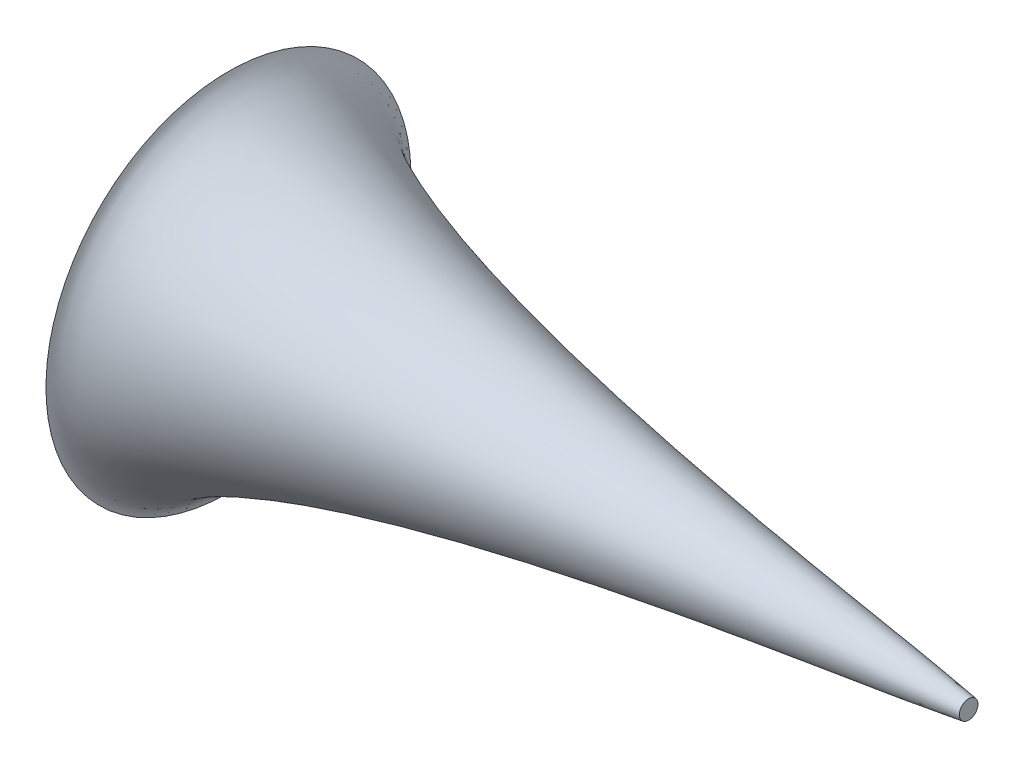
ISO-10303-21;
HEADER;
FILE_DESCRIPTION(('STEP AP214'),'2;1');
FILE_NAME('part.step','',(''),(''),'','','');
FILE_SCHEMA(('AUTOMOTIVE_DESIGN { 1 0 10303 214 1 1 1 1 }'));
ENDSEC;
DATA;
#1=APPLICATION_CONTEXT('core data for automotive mechanical design processes');
#2=APPLICATION_PROTOCOL_DEFINITION('international standard','automotive_design',2000,#1);
#3=PRODUCT_CONTEXT('',#1,'mechanical');
#4=PRODUCT('Part','Part','',(#3));
#5=PRODUCT_RELATED_PRODUCT_CATEGORY('part','',(#4));
#6=PRODUCT_DEFINITION_FORMATION('','',#4);
#7=PRODUCT_DEFINITION_CONTEXT('part definition',#1,'design');
#8=PRODUCT_DEFINITION('design','',#6,#7);
#9=PRODUCT_DEFINITION_SHAPE('','',#8);
#10=(LENGTH_UNIT() NAMED_UNIT(*) SI_UNIT(.MILLI.,.METRE.));
#11=(NAMED_UNIT(*) PLANE_ANGLE_UNIT() SI_UNIT($,.RADIAN.));
#12=(NAMED_UNIT(*) SI_UNIT($,.STERADIAN.) SOLID_ANGLE_UNIT());
#13=UNCERTAINTY_MEASURE_WITH_UNIT(LENGTH_MEASURE(1.E-05),#10,'distance_accuracy_value','');
#14=(GEOMETRIC_REPRESENTATION_CONTEXT(3) GLOBAL_UNCERTAINTY_ASSIGNED_CONTEXT((#13)) GLOBAL_UNIT_ASSIGNED_CONTEXT((#10,
#11,#12)) REPRESENTATION_CONTEXT('',''));
#15=CARTESIAN_POINT('',(0.,0.,0.));
#16=DIRECTION('',(0.,0.,1.));
#17=DIRECTION('',(1.,0.,0.));
#18=AXIS2_PLACEMENT_3D('',#15,#16,#17);
#19=CARTESIAN_POINT('',(102.602827350741,1.29640535163829,0.));
#20=CARTESIAN_POINT('',(101.30783530733,1.4860392481115,0.));
#21=CARTESIAN_POINT('',(99.0890550643406,1.81094930839849,0.));
#22=CARTESIAN_POINT('',(95.982778147195,2.24838979218013,0.));
#23=CARTESIAN_POINT('',(93.2934154301074,2.60691223367868,0.));
#24=CARTESIAN_POINT('',(90.6610180598882,2.94649116716827,0.));
#25=CARTESIAN_POINT('',(88.0028759358108,3.27762262314463,0.));
#26=CARTESIAN_POINT('',(85.3353915975262,3.61914481132584,0.));
#27=CARTESIAN_POINT('',(82.697877775363,3.9642635078406,0.));
#28=CARTESIAN_POINT('',(80.1628026617709,4.29745747858391,0.));
#29=CARTESIAN_POINT('',(77.7185372264278,4.62024778991419,0.));
#30=CARTESIAN_POINT('',(75.2874120028403,4.94180984509993,0.));
#31=CARTESIAN_POINT('',(72.8844146689748,5.27159887786089,0.));
#32=CARTESIAN_POINT('',(70.5261567062274,5.59970688141345,0.));
#33=CARTESIAN_POINT('',(68.2556983787091,5.92022156106632,0.));
#34=CARTESIAN_POINT('',(66.0138055766903,6.24000540538133,0.));
#35=CARTESIAN_POINT('',(63.8058521271992,6.56514107213416,0.));
#36=CARTESIAN_POINT('',(61.6414371018312,6.88975949444084,0.));
#37=CARTESIAN_POINT('',(59.5399173239007,7.21001620939399,0.));
#38=CARTESIAN_POINT('',(57.4741981186759,7.53169535507364,0.));
#39=CARTESIAN_POINT('',(55.4456721371335,7.855773281869,0.));
#40=CARTESIAN_POINT('',(53.4725369298471,8.17758973965462,0.));
#41=CARTESIAN_POINT('',(51.5378860240744,8.49813854708863,0.));
#42=CARTESIAN_POINT('',(49.6421928987376,8.82173889884151,0.));
#43=CARTESIAN_POINT('',(47.7855770043129,9.14566570955426,0.));
#44=CARTESIAN_POINT('',(45.976749193766,9.46728214953978,0.));
#45=CARTESIAN_POINT('',(44.2080943795777,9.79032659477329,0.));
#46=CARTESIAN_POINT('',(42.4789803973668,10.1137981501915,0.));
#47=CARTESIAN_POINT('',(40.7924880295433,10.4357820518005,0.));
#48=CARTESIAN_POINT('',(39.1470139808039,10.7583629066834,0.));
#49=CARTESIAN_POINT('',(37.5416909121418,11.0809361727218,0.));
#50=CARTESIAN_POINT('',(35.975380158997,11.4023813085769,0.));
#51=CARTESIAN_POINT('',(34.4505135868508,11.7240318907528,0.));
#52=CARTESIAN_POINT('',(32.9641682479258,12.0453135429327,0.));
#53=CARTESIAN_POINT('',(31.5164287028101,12.3653418749793,0.));
#54=CARTESIAN_POINT('',(30.1101818682611,12.6850928136249,0.));
#55=CARTESIAN_POINT('',(28.737407170817,13.0046837443431,0.));
#56=CARTESIAN_POINT('',(27.4067720570208,13.3225084421185,0.));
#57=CARTESIAN_POINT('',(26.1173258019394,13.6388997002961,0.));
#58=CARTESIAN_POINT('',(24.8602886497066,13.9546344019831,0.));
#59=CARTESIAN_POINT('',(23.645020088169,14.2687505552191,0.));
#60=CARTESIAN_POINT('',(22.4614876863863,14.5823857170225,0.));
#61=CARTESIAN_POINT('',(21.3186458463609,14.8935203517181,0.));
#62=CARTESIAN_POINT('',(20.2138203352792,15.2025977665398,0.));
#63=CARTESIAN_POINT('',(19.1418978833922,15.5102840518628,0.));
#64=CARTESIAN_POINT('',(18.111343585981,15.814780957447,0.));
#65=CARTESIAN_POINT('',(17.1090349624144,16.1185912467767,0.));
#66=CARTESIAN_POINT('',(16.1480947593759,16.4186360289038,0.));
#67=CARTESIAN_POINT('',(15.2152869431263,16.717725087723,0.));
#68=CARTESIAN_POINT('',(14.3225359015949,17.012557012406,0.));
#69=CARTESIAN_POINT('',(13.4596078512331,17.3055281715088,0.));
#70=CARTESIAN_POINT('',(12.6336676776253,17.5943932948036,0.));
#71=CARTESIAN_POINT('',(11.8380002912862,17.8807345856671,0.));
#72=CARTESIAN_POINT('',(11.0774376925416,18.1628197902775,0.));
#73=CARTESIAN_POINT('',(10.3464866754969,18.4419927102913,0.));
#74=CARTESIAN_POINT('',(9.64984849906658,18.716395941831,0.));
#75=CARTESIAN_POINT('',(8.98113949963053,18.9878277300666,0.));
#76=CARTESIAN_POINT('',(8.34693062033733,19.2535503514199,0.));
#77=CARTESIAN_POINT('',(7.73802410938301,19.5166386093796,0.));
#78=CARTESIAN_POINT('',(7.16326902960444,19.7732127412955,0.));
#79=CARTESIAN_POINT('',(6.61176616263548,20.0273506756737,0.));
#80=CARTESIAN_POINT('',(6.09245619358488,20.274788093451,0.));
#81=CARTESIAN_POINT('',(5.59739491321512,20.5186114176915,0.));
#82=CARTESIAN_POINT('',(5.131115322291,20.7562289167767,0.));
#83=CARTESIAN_POINT('',(4.69249252100954,20.9876069507676,0.));
#84=CARTESIAN_POINT('',(4.27680094845867,21.2147210597118,0.));
#85=CARTESIAN_POINT('',(3.88775107856244,21.4350832657669,0.));
#86=CARTESIAN_POINT('',(3.52019681282255,21.6509716537916,0.));
#87=CARTESIAN_POINT('',(3.1774689226165,21.8599812775175,0.));
#88=CARTESIAN_POINT('',(2.85798044640234,22.0623509412686,0.));
#89=CARTESIAN_POINT('',(2.55909006407686,22.2592326116133,0.));
#90=CARTESIAN_POINT('',(2.28168626847477,22.4494307748566,0.));
#91=CARTESIAN_POINT('',(2.02436283230884,22.6331678776642,0.));
#92=CARTESIAN_POINT('',(1.78659949341602,22.8103019934508,0.));
#93=CARTESIAN_POINT('',(1.56719940485286,22.9809882973866,0.));
#94=CARTESIAN_POINT('',(1.36493335038758,23.1454412271058,0.));
#95=CARTESIAN_POINT('',(1.1810633375169,23.3019954016058,0.));
#96=CARTESIAN_POINT('',(1.01260739148691,23.4524802493133,0.));
#97=CARTESIAN_POINT('',(0.858468391473778,23.5970417630544,0.));
#98=CARTESIAN_POINT('',(0.719443465609688,23.7341965380326,0.));
#99=CARTESIAN_POINT('',(0.595125281530059,23.8636465962845,0.));
#100=CARTESIAN_POINT('',(0.482442645174261,23.9876783764902,0.));
#101=CARTESIAN_POINT('',(0.380535302779585,24.1064391414272,0.));
#102=CARTESIAN_POINT('',(0.290939558067533,24.2173825482975,0.));
#103=CARTESIAN_POINT('',(0.213334194764,24.3198652148961,0.));
#104=CARTESIAN_POINT('',(0.144079958190839,24.417864636037,0.));
#105=CARTESIAN_POINT('',(0.0821429505746585,24.511964999009,0.));
#106=CARTESIAN_POINT('',(0.0279908653003298,24.600574940189,0.));
#107=CARTESIAN_POINT('',(-0.0171704725853648,24.6808944151075,0.));
#108=CARTESIAN_POINT('',(-0.0544503346226113,24.7533573028025,0.));
#109=CARTESIAN_POINT('',(-0.0864836754521647,24.8221377736665,0.));
#110=CARTESIAN_POINT('',(-0.169506010317748,25.019375845971,0.));
#111=CARTESIAN_POINT('',(-0.211687245446844,25.2049209692372,0.));
#112=CARTESIAN_POINT('',(-0.248424230956055,25.3665181458934,0.));
#113=B_SPLINE_CURVE_WITH_KNOTS('',3,(#19,#20,#21,#22,#23,#24,#25,#26,#27,#28,#29,#30,#31,#32,
#33,#34,#35,#36,#37,#38,#39,#40,#41,#42,#43,#44,#45,#46,#47,#48,#49,#50,#51,#52,#53,#54,#55,#56,
#57,#58,#59,#60,#61,#62,#63,#64,#65,#66,#67,#68,#69,#70,#71,#72,#73,#74,#75,#76,#77,#78,#79,#80,
#81,#82,#83,#84,#85,#86,#87,#88,#89,#90,#91,#92,#93,#94,#95,#96,#97,#98,#99,#100,#101,#102,#103,
#104,#105,#106,#107,#108,#109,#110,#111,#112),.UNSPECIFIED.,.F.,.F.,(4,1,1,1,1,1,1,1,1,1,1,1,1,
1,1,1,1,1,1,1,1,1,1,1,1,1,1,1,1,1,1,1,1,1,1,1,1,1,1,1,1,1,1,1,1,1,1,1,1,1,1,1,1,1,1,1,1,1,1,1,1,
1,1,1,1,1,1,1,1,1,1,1,1,1,1,1,1,1,1,1,1,1,1,1,1,1,1,1,1,1,1,4),(0.,0.0366988220254521,
0.0628780861360187,0.0879587952974897,0.112775273315443,0.137301970406442,0.163069142200047,
0.188181970048719,0.211888316473663,0.234764032162099,0.257314306202074,0.280650701052734,
0.302775523229076,0.324076836325487,0.344945600186904,0.366274409703858,0.38665536715319,
0.406314586251673,0.425881302954634,0.445276127579016,0.463915656617279,0.481939052341656,
0.500263215050945,0.517839621328899,0.534784937759717,0.551778131501739,0.568252989685148,
0.58411030834917,0.599921398554794,0.615270159210775,0.630023218422055,0.644755948969825,
0.658968096929762,0.672662756069127,0.686330380985329,0.699405531540559,0.712184574559887,
0.724690707098495,0.736633935464125,0.748526532625256,0.759886493295667,0.770965463137425,
0.78173790455996,0.792054988066912,0.802235631156459,0.811869370937949,0.821422167456131,
0.830463038439142,0.839336627905971,0.84778438117671,0.856015731682047,0.863871223787843,
0.871495318388664,0.878761124073918,0.885810751841992,0.892489438061742,0.898997143893412,
0.905091387483872,0.911088313829182,0.916645743752842,0.922118017304352,0.927217758076402,
0.932119108170101,0.936791843384509,0.941122570664471,0.94540084901306,0.949328667361226,
0.953074610768057,0.956656474999225,0.959932525676617,0.963109806149952,0.966087045013538,
0.968797857382643,0.971422894608393,0.973880886589834,0.976106853813501,0.978193669239014,
0.98021404919799,0.982031703064139,0.983669063053836,0.985245997700396,0.98672988442057,
0.988056427698809,0.989243995888355,0.990333825031772,0.99142063998937,0.992402243606459,
0.993245076861825,0.994003863069321,0.994686572263839,0.995372366002319,1.),.UNSPECIFIED.);
#114=CARTESIAN_POINT('',(-0.248424230956053,0.,0.));
#115=DIRECTION('',(-1.,0.,0.));
#116=AXIS1_PLACEMENT('',#114,#115);
#117=SURFACE_OF_REVOLUTION('',#113,#116);
#118=CARTESIAN_POINT('',(-0.248424230956055,0.,0.));
#119=DIRECTION('',(-1.,0.,0.));
#120=DIRECTION('',(0.,-1.,0.));
#121=AXIS2_PLACEMENT_3D('',#118,#119,#120);
#122=CIRCLE('',#121,25.3665181458934);
#123=CARTESIAN_POINT('',(-0.248424230956055,-25.3665181458934,0.));
#124=VERTEX_POINT('',#123);
#125=EDGE_CURVE('E47',#124,#124,#122,.T.);
#126=ORIENTED_EDGE('',*,*,#125,.F.);
#127=EDGE_LOOP('',(#126));
#128=FACE_BOUND('',#127,.T.);
#129=CARTESIAN_POINT('',(102.602827350741,0.,0.));
#130=DIRECTION('',(-1.,0.,0.));
#131=DIRECTION('',(0.,-1.,0.));
#132=AXIS2_PLACEMENT_3D('',#129,#130,#131);
#133=CIRCLE('',#132,1.29640535163829);
#134=CARTESIAN_POINT('',(102.602827350741,-1.29640535163829,0.));
#135=VERTEX_POINT('',#134);
#136=EDGE_CURVE('E10',#135,#135,#133,.T.);
#137=ORIENTED_EDGE('',*,*,#136,.T.);
#138=EDGE_LOOP('',(#137));
#139=FACE_BOUND('',#138,.T.);
#140=ADVANCED_FACE('F39',(#128,#139),#117,.T.);
#141=CARTESIAN_POINT('',(102.602827350741,0.,0.));
#142=DIRECTION('',(-1.,0.,0.));
#143=DIRECTION('',(0.,-1.,0.));
#144=AXIS2_PLACEMENT_3D('',#141,#142,#143);
#145=PLANE('',#144);
#146=ORIENTED_EDGE('',*,*,#136,.F.);
#147=EDGE_LOOP('',(#146));
#148=FACE_BOUND('',#147,.T.);
#149=ADVANCED_FACE('F63',(#148),#145,.F.);
#150=CARTESIAN_POINT('',(-0.248424230956054,25.3665181458934,0.));
#151=DIRECTION('',(1.,0.,0.));
#152=DIRECTION('',(0.,1.,0.));
#153=AXIS2_PLACEMENT_3D('',#150,#151,#152);
#154=PLANE('',#153);
#155=ORIENTED_EDGE('',*,*,#125,.T.);
#156=EDGE_LOOP('',(#155));
#157=FACE_BOUND('',#156,.T.);
#158=ADVANCED_FACE('F60',(#157),#154,.F.);
#159=CLOSED_SHELL('',(#140,#149,#158));
#160=MANIFOLD_SOLID_BREP('B2',#159);
#161=ADVANCED_BREP_SHAPE_REPRESENTATION('',(#18,#160),#14);
#162=SHAPE_DEFINITION_REPRESENTATION(#9,#161);
ENDSEC;
END-ISO-10303-21;
